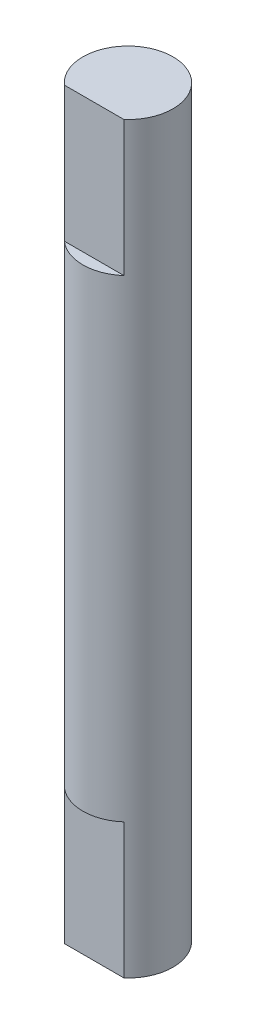
ISO-10303-21;
HEADER;
FILE_DESCRIPTION(('STEP AP214'),'2;1');
FILE_NAME('part.step','',(''),(''),'','','');
FILE_SCHEMA(('AUTOMOTIVE_DESIGN { 1 0 10303 214 1 1 1 1 }'));
ENDSEC;
DATA;
#1=APPLICATION_CONTEXT('core data for automotive mechanical design processes');
#2=APPLICATION_PROTOCOL_DEFINITION('international standard','automotive_design',2000,#1);
#3=PRODUCT_CONTEXT('',#1,'mechanical');
#4=PRODUCT('Part','Part','',(#3));
#5=PRODUCT_RELATED_PRODUCT_CATEGORY('part','',(#4));
#6=PRODUCT_DEFINITION_FORMATION('','',#4);
#7=PRODUCT_DEFINITION_CONTEXT('part definition',#1,'design');
#8=PRODUCT_DEFINITION('design','',#6,#7);
#9=PRODUCT_DEFINITION_SHAPE('','',#8);
#10=(LENGTH_UNIT() NAMED_UNIT(*) SI_UNIT(.MILLI.,.METRE.));
#11=(NAMED_UNIT(*) PLANE_ANGLE_UNIT() SI_UNIT($,.RADIAN.));
#12=(NAMED_UNIT(*) SI_UNIT($,.STERADIAN.) SOLID_ANGLE_UNIT());
#13=UNCERTAINTY_MEASURE_WITH_UNIT(LENGTH_MEASURE(1.E-05),#10,'distance_accuracy_value','');
#14=(GEOMETRIC_REPRESENTATION_CONTEXT(3) GLOBAL_UNCERTAINTY_ASSIGNED_CONTEXT((#13)) GLOBAL_UNIT_ASSIGNED_CONTEXT((#10,
#11,#12)) REPRESENTATION_CONTEXT('',''));
#15=CARTESIAN_POINT('',(0.,0.,0.));
#16=DIRECTION('',(0.,0.,1.));
#17=DIRECTION('',(1.,0.,0.));
#18=AXIS2_PLACEMENT_3D('',#15,#16,#17);
#19=CARTESIAN_POINT('',(0.,66.,0.));
#20=DIRECTION('',(0.,-1.,0.));
#21=DIRECTION('',(0.,0.,-1.));
#22=AXIS2_PLACEMENT_3D('',#19,#20,#21);
#23=CYLINDRICAL_SURFACE('',#22,4.);
#24=DIRECTION('',(0.,1.,0.));
#25=VECTOR('',#24,1.);
#26=CARTESIAN_POINT('',(-2.64575131106459,54.,3.));
#27=LINE('',#26,#25);
#28=CARTESIAN_POINT('',(-2.64575131106459,54.,3.));
#29=VERTEX_POINT('',#28);
#30=CARTESIAN_POINT('',(-2.64575131106459,66.,3.));
#31=VERTEX_POINT('',#30);
#32=EDGE_CURVE('E88',#29,#31,#27,.T.);
#33=ORIENTED_EDGE('',*,*,#32,.T.);
#34=CARTESIAN_POINT('',(0.,66.,0.));
#35=DIRECTION('',(0.,1.,0.));
#36=DIRECTION('',(0.,0.,1.));
#37=AXIS2_PLACEMENT_3D('',#34,#35,#36);
#38=CIRCLE('',#37,4.);
#39=CARTESIAN_POINT('',(2.64575131106459,66.,3.));
#40=VERTEX_POINT('',#39);
#41=EDGE_CURVE('E11',#40,#31,#38,.T.);
#42=ORIENTED_EDGE('',*,*,#41,.F.);
#43=DIRECTION('',(0.,1.,0.));
#44=VECTOR('',#43,1.);
#45=CARTESIAN_POINT('',(2.64575131106459,54.,3.));
#46=LINE('',#45,#44);
#47=CARTESIAN_POINT('',(2.64575131106459,54.,3.));
#48=VERTEX_POINT('',#47);
#49=EDGE_CURVE('E56',#48,#40,#46,.T.);
#50=ORIENTED_EDGE('',*,*,#49,.F.);
#51=CARTESIAN_POINT('',(0.,54.,0.));
#52=DIRECTION('',(0.,1.,0.));
#53=DIRECTION('',(0.,0.,1.));
#54=AXIS2_PLACEMENT_3D('',#51,#52,#53);
#55=CIRCLE('',#54,4.);
#56=EDGE_CURVE('E91',#29,#48,#55,.T.);
#57=ORIENTED_EDGE('',*,*,#56,.F.);
#58=EDGE_LOOP('',(#33,#42,#50,#57));
#59=FACE_BOUND('',#58,.T.);
#60=DIRECTION('',(0.,1.,0.));
#61=VECTOR('',#60,1.);
#62=CARTESIAN_POINT('',(2.64575131106459,-83.703345213916,3.));
#63=LINE('',#62,#61);
#64=CARTESIAN_POINT('',(2.64575131106459,0.,3.));
#65=VERTEX_POINT('',#64);
#66=CARTESIAN_POINT('',(2.64575131106459,12.,3.));
#67=VERTEX_POINT('',#66);
#68=EDGE_CURVE('E48',#65,#67,#63,.T.);
#69=ORIENTED_EDGE('',*,*,#68,.F.);
#70=CARTESIAN_POINT('',(0.,0.,0.));
#71=DIRECTION('',(0.,1.,0.));
#72=DIRECTION('',(0.,0.,1.));
#73=AXIS2_PLACEMENT_3D('',#70,#71,#72);
#74=CIRCLE('',#73,4.);
#75=CARTESIAN_POINT('',(-2.64575131106459,0.,3.));
#76=VERTEX_POINT('',#75);
#77=EDGE_CURVE('E37',#65,#76,#74,.T.);
#78=ORIENTED_EDGE('',*,*,#77,.T.);
#79=DIRECTION('',(0.,1.,0.));
#80=VECTOR('',#79,1.);
#81=CARTESIAN_POINT('',(-2.64575131106459,-83.703345213916,3.));
#82=LINE('',#81,#80);
#83=CARTESIAN_POINT('',(-2.64575131106459,12.,3.));
#84=VERTEX_POINT('',#83);
#85=EDGE_CURVE('E73',#76,#84,#82,.T.);
#86=ORIENTED_EDGE('',*,*,#85,.T.);
#87=CARTESIAN_POINT('',(0.,12.,0.));
#88=DIRECTION('',(0.,1.,0.));
#89=DIRECTION('',(0.,0.,1.));
#90=AXIS2_PLACEMENT_3D('',#87,#88,#89);
#91=CIRCLE('',#90,4.);
#92=EDGE_CURVE('E86',#84,#67,#91,.T.);
#93=ORIENTED_EDGE('',*,*,#92,.T.);
#94=EDGE_LOOP('',(#69,#78,#86,#93));
#95=FACE_BOUND('',#94,.T.);
#96=ADVANCED_FACE('F34',(#59,#95),#23,.T.);
#97=CARTESIAN_POINT('',(0.,66.,0.));
#98=DIRECTION('',(0.,1.,0.));
#99=DIRECTION('',(0.,0.,1.));
#100=AXIS2_PLACEMENT_3D('',#97,#98,#99);
#101=PLANE('',#100);
#102=ORIENTED_EDGE('',*,*,#41,.T.);
#103=DIRECTION('',(1.,0.,0.));
#104=VECTOR('',#103,1.);
#105=CARTESIAN_POINT('',(-2.64575131106459,66.,3.));
#106=LINE('',#105,#104);
#107=EDGE_CURVE('E81',#31,#40,#106,.T.);
#108=ORIENTED_EDGE('',*,*,#107,.T.);
#109=EDGE_LOOP('',(#102,#108));
#110=FACE_BOUND('',#109,.T.);
#111=ADVANCED_FACE('F112',(#110),#101,.T.);
#112=CARTESIAN_POINT('',(0.,0.,0.));
#113=DIRECTION('',(0.,1.,0.));
#114=DIRECTION('',(0.,0.,1.));
#115=AXIS2_PLACEMENT_3D('',#112,#113,#114);
#116=PLANE('',#115);
#117=ORIENTED_EDGE('',*,*,#77,.F.);
#118=DIRECTION('',(-1.,0.,0.));
#119=VECTOR('',#118,1.);
#120=CARTESIAN_POINT('',(-2.64575131106459,0.,3.));
#121=LINE('',#120,#119);
#122=EDGE_CURVE('E76',#65,#76,#121,.T.);
#123=ORIENTED_EDGE('',*,*,#122,.T.);
#124=EDGE_LOOP('',(#117,#123));
#125=FACE_BOUND('',#124,.T.);
#126=ADVANCED_FACE('F85',(#125),#116,.F.);
#127=CARTESIAN_POINT('',(-2.64575131106459,54.,3.));
#128=DIRECTION('',(0.,0.,1.));
#129=DIRECTION('',(1.,0.,0.));
#130=AXIS2_PLACEMENT_3D('',#127,#128,#129);
#131=PLANE('',#130);
#132=ORIENTED_EDGE('',*,*,#107,.F.);
#133=ORIENTED_EDGE('',*,*,#32,.F.);
#134=DIRECTION('',(1.,0.,0.));
#135=VECTOR('',#134,1.);
#136=CARTESIAN_POINT('',(-2.64575131106459,54.,3.));
#137=LINE('',#136,#135);
#138=EDGE_CURVE('E95',#29,#48,#137,.T.);
#139=ORIENTED_EDGE('',*,*,#138,.T.);
#140=ORIENTED_EDGE('',*,*,#49,.T.);
#141=EDGE_LOOP('',(#132,#133,#139,#140));
#142=FACE_BOUND('',#141,.T.);
#143=ADVANCED_FACE('F122',(#142),#131,.T.);
#144=CARTESIAN_POINT('',(0.,54.,0.));
#145=DIRECTION('',(0.,1.,0.));
#146=DIRECTION('',(0.,0.,1.));
#147=AXIS2_PLACEMENT_3D('',#144,#145,#146);
#148=PLANE('',#147);
#149=ORIENTED_EDGE('',*,*,#138,.F.);
#150=ORIENTED_EDGE('',*,*,#56,.T.);
#151=EDGE_LOOP('',(#149,#150));
#152=FACE_BOUND('',#151,.T.);
#153=ADVANCED_FACE('F108',(#152),#148,.T.);
#154=CARTESIAN_POINT('',(-2.64575131106459,-83.703345213916,3.));
#155=DIRECTION('',(0.,0.,1.));
#156=DIRECTION('',(1.,0.,0.));
#157=AXIS2_PLACEMENT_3D('',#154,#155,#156);
#158=PLANE('',#157);
#159=ORIENTED_EDGE('',*,*,#122,.F.);
#160=ORIENTED_EDGE('',*,*,#68,.T.);
#161=DIRECTION('',(-1.,0.,0.));
#162=VECTOR('',#161,1.);
#163=CARTESIAN_POINT('',(-2.64575131106459,12.,3.));
#164=LINE('',#163,#162);
#165=EDGE_CURVE('E77',#67,#84,#164,.T.);
#166=ORIENTED_EDGE('',*,*,#165,.T.);
#167=ORIENTED_EDGE('',*,*,#85,.F.);
#168=EDGE_LOOP('',(#159,#160,#166,#167));
#169=FACE_BOUND('',#168,.T.);
#170=ADVANCED_FACE('F75',(#169),#158,.T.);
#171=CARTESIAN_POINT('',(0.,12.,0.));
#172=DIRECTION('',(0.,1.,0.));
#173=DIRECTION('',(0.,0.,1.));
#174=AXIS2_PLACEMENT_3D('',#171,#172,#173);
#175=PLANE('',#174);
#176=ORIENTED_EDGE('',*,*,#92,.F.);
#177=ORIENTED_EDGE('',*,*,#165,.F.);
#178=EDGE_LOOP('',(#176,#177));
#179=FACE_BOUND('',#178,.T.);
#180=ADVANCED_FACE('F102',(#179),#175,.F.);
#181=CLOSED_SHELL('',(#96,#111,#126,#143,#153,#170,#180));
#182=MANIFOLD_SOLID_BREP('B2',#181);
#183=ADVANCED_BREP_SHAPE_REPRESENTATION('',(#18,#182),#14);
#184=SHAPE_DEFINITION_REPRESENTATION(#9,#183);
ENDSEC;
END-ISO-10303-21;
